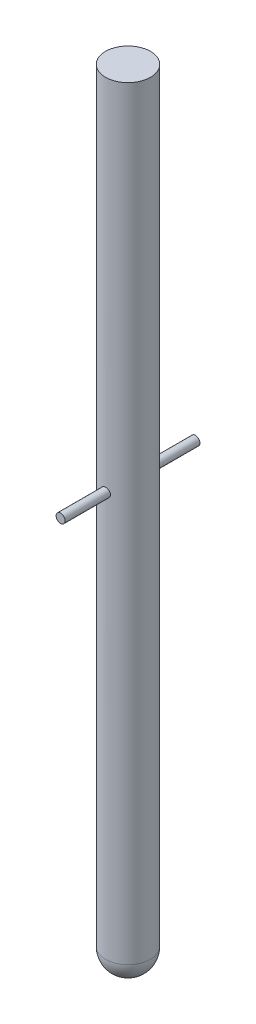
ISO-10303-21;
HEADER;
FILE_DESCRIPTION(('STEP AP214'),'2;1');
FILE_NAME('part.step','',(''),(''),'','','');
FILE_SCHEMA(('AUTOMOTIVE_DESIGN { 1 0 10303 214 1 1 1 1 }'));
ENDSEC;
DATA;
#1=APPLICATION_CONTEXT('core data for automotive mechanical design processes');
#2=APPLICATION_PROTOCOL_DEFINITION('international standard','automotive_design',2000,#1);
#3=PRODUCT_CONTEXT('',#1,'mechanical');
#4=PRODUCT('Part','Part','',(#3));
#5=PRODUCT_RELATED_PRODUCT_CATEGORY('part','',(#4));
#6=PRODUCT_DEFINITION_FORMATION('','',#4);
#7=PRODUCT_DEFINITION_CONTEXT('part definition',#1,'design');
#8=PRODUCT_DEFINITION('design','',#6,#7);
#9=PRODUCT_DEFINITION_SHAPE('','',#8);
#10=(LENGTH_UNIT() NAMED_UNIT(*) SI_UNIT(.MILLI.,.METRE.));
#11=(NAMED_UNIT(*) PLANE_ANGLE_UNIT() SI_UNIT($,.RADIAN.));
#12=(NAMED_UNIT(*) SI_UNIT($,.STERADIAN.) SOLID_ANGLE_UNIT());
#13=UNCERTAINTY_MEASURE_WITH_UNIT(LENGTH_MEASURE(1.E-05),#10,'distance_accuracy_value','');
#14=(GEOMETRIC_REPRESENTATION_CONTEXT(3) GLOBAL_UNCERTAINTY_ASSIGNED_CONTEXT((#13)) GLOBAL_UNIT_ASSIGNED_CONTEXT((#10,
#11,#12)) REPRESENTATION_CONTEXT('',''));
#15=CARTESIAN_POINT('',(0.,0.,0.));
#16=DIRECTION('',(0.,0.,1.));
#17=DIRECTION('',(1.,0.,0.));
#18=AXIS2_PLACEMENT_3D('',#15,#16,#17);
#19=CARTESIAN_POINT('',(0.,175.,0.));
#20=DIRECTION('',(0.,-1.,0.));
#21=DIRECTION('',(0.,0.,-1.));
#22=AXIS2_PLACEMENT_3D('',#19,#20,#21);
#23=CYLINDRICAL_SURFACE('',#22,5.);
#24=CARTESIAN_POINT('',(0.,5.,0.));
#25=DIRECTION('',(0.,-1.,0.));
#26=DIRECTION('',(0.,0.,-1.));
#27=AXIS2_PLACEMENT_3D('',#24,#25,#26);
#28=CIRCLE('',#27,5.);
#29=CARTESIAN_POINT('',(0.,5.,-5.));
#30=VERTEX_POINT('',#29);
#31=EDGE_CURVE('E10',#30,#30,#28,.F.);
#32=ORIENTED_EDGE('',*,*,#31,.T.);
#33=EDGE_LOOP('',(#32));
#34=FACE_BOUND('',#33,.T.);
#35=CARTESIAN_POINT('',(0.,96.,-5.));
#36=CARTESIAN_POINT('',(-0.0555769067926326,95.9999979555017,-4.99999897580871));
#37=CARTESIAN_POINT('',(-0.111179660201522,95.9953511570324,-4.99906385178231));
#38=CARTESIAN_POINT('',(-0.220813507689018,95.9769014998848,-4.99542365623231));
#39=CARTESIAN_POINT('',(-0.274843317541354,95.9630913671985,-4.99271717860186));
#40=CARTESIAN_POINT('',(-0.379730305263313,95.9267587263792,-4.98583649278287));
#41=CARTESIAN_POINT('',(-0.430590467933138,95.9042445631553,-4.98166369076718));
#42=CARTESIAN_POINT('',(-0.527807988864228,95.8511677524887,-4.97230398035314));
#43=CARTESIAN_POINT('',(-0.57416561507581,95.8206055843928,-4.96711713235707));
#44=CARTESIAN_POINT('',(-0.661693477314865,95.7518615057086,-4.9562216532997));
#45=CARTESIAN_POINT('',(-0.702793951158531,95.7135916446088,-4.95050745504347));
#46=CARTESIAN_POINT('',(-0.778036756608037,95.6307075836083,-4.93924180452588));
#47=CARTESIAN_POINT('',(-0.812178544770429,95.5860928886649,-4.93369036500424));
#48=CARTESIAN_POINT('',(-0.872831753347622,95.4912838069881,-4.92332441812615));
#49=CARTESIAN_POINT('',(-0.89927093886587,95.4410423562036,-4.91851707364946));
#50=CARTESIAN_POINT('',(-0.943305666580311,95.3367181809959,-4.91026268058418));
#51=CARTESIAN_POINT('',(-0.960902082437239,95.2826358366537,-4.90681549761962));
#52=CARTESIAN_POINT('',(-0.986525299884826,95.1729156360921,-4.90172805252205));
#53=CARTESIAN_POINT('',(-0.994674497958775,95.1173074558578,-4.90006470107188));
#54=CARTESIAN_POINT('',(-1.00155212772612,95.0054901786357,-4.89866375060627));
#55=CARTESIAN_POINT('',(-1.0002815227135,94.9492811436799,-4.89892595467841));
#56=CARTESIAN_POINT('',(-0.988454573101821,94.838753211979,-4.90132551148185));
#57=CARTESIAN_POINT('',(-0.978038540243909,94.7844185943727,-4.90343452858763));
#58=CARTESIAN_POINT('',(-0.948437884623055,94.678283923337,-4.90924546160001));
#59=CARTESIAN_POINT('',(-0.929252843100686,94.626483991081,-4.91294745357779));
#60=CARTESIAN_POINT('',(-0.882524783674724,94.5264847382964,-4.92155618500408));
#61=CARTESIAN_POINT('',(-0.854926151232117,94.4783121204308,-4.92647089813704));
#62=CARTESIAN_POINT('',(-0.79219357457268,94.3872291500272,-4.93694618773062));
#63=CARTESIAN_POINT('',(-0.75705876435683,94.3443194031488,-4.94250683838366));
#64=CARTESIAN_POINT('',(-0.67949993456058,94.2641705975431,-4.95377021241462));
#65=CARTESIAN_POINT('',(-0.636956161212438,94.2270474321409,-4.95947369210905));
#66=CARTESIAN_POINT('',(-0.546185024062002,94.1604461536988,-4.97028848714409));
#67=CARTESIAN_POINT('',(-0.497957587379384,94.1309681387064,-4.97539979488974));
#68=CARTESIAN_POINT('',(-0.397059386878918,94.080472490774,-4.98446690160887));
#69=CARTESIAN_POINT('',(-0.344381819585298,94.0594681063555,-4.98842088848272));
#70=CARTESIAN_POINT('',(-0.236148976448666,94.0266395259614,-4.99471408987858));
#71=CARTESIAN_POINT('',(-0.180594050072453,94.0148142179264,-4.99705350000531));
#72=CARTESIAN_POINT('',(-0.0691794056271565,94.0008435462057,-4.99982671866868));
#73=CARTESIAN_POINT('',(-0.0133403283255816,93.9985395804597,-5.0002917465247));
#74=CARTESIAN_POINT('',(0.0979249341927104,94.0032498589422,-4.99935051930103));
#75=CARTESIAN_POINT('',(0.15335114244379,94.0102635793526,-4.99794436941446));
#76=CARTESIAN_POINT('',(0.261705659946537,94.033278373544,-4.99343832008018));
#77=CARTESIAN_POINT('',(0.314651948339898,94.0491980684979,-4.99035376404207));
#78=CARTESIAN_POINT('',(0.417123627499664,94.0894839826558,-4.98283552061033));
#79=CARTESIAN_POINT('',(0.466648761637539,94.1138508346768,-4.97840173214227));
#80=CARTESIAN_POINT('',(0.561541173686218,94.1706824906513,-4.96859911533294));
#81=CARTESIAN_POINT('',(0.606850126752186,94.203242781039,-4.96321950437052));
#82=CARTESIAN_POINT('',(0.691418019119206,94.2754091912073,-4.95214734829882));
#83=CARTESIAN_POINT('',(0.730676308930766,94.3150160663999,-4.94645476968388));
#84=CARTESIAN_POINT('',(0.802640590774179,94.4008733518911,-4.93529303556965));
#85=CARTESIAN_POINT('',(0.835237702448654,94.4472157442213,-4.92982860233304));
#86=CARTESIAN_POINT('',(0.8921854200512,94.5448113613567,-4.91984191796194));
#87=CARTESIAN_POINT('',(0.916536355922897,94.5960643895735,-4.91531962913343));
#88=CARTESIAN_POINT('',(0.956151841581955,94.7017682461495,-4.90776740584383));
#89=CARTESIAN_POINT('',(0.971463499791046,94.7562008412103,-4.90472974872187));
#90=CARTESIAN_POINT('',(0.992708651627194,94.8669334534909,-4.90047436792025));
#91=CARTESIAN_POINT('',(0.998643368225111,94.9232332262093,-4.89925640691111));
#92=CARTESIAN_POINT('',(1.00092091086747,95.0350088645443,-4.89879149631379));
#93=CARTESIAN_POINT('',(0.997435788070897,95.090481148927,-4.89950919189301));
#94=CARTESIAN_POINT('',(0.981352304100062,95.200031649905,-4.90275573484614));
#95=CARTESIAN_POINT('',(0.968754016129299,95.2541098776948,-4.90528456767169));
#96=CARTESIAN_POINT('',(0.934878568498952,95.3592277112405,-4.91185264219159));
#97=CARTESIAN_POINT('',(0.913622506717341,95.4102743605024,-4.91588821018831));
#98=CARTESIAN_POINT('',(0.8630546446016,95.5081037207344,-4.9250171497417));
#99=CARTESIAN_POINT('',(0.833742168774879,95.5548860737252,-4.93011060998894));
#100=CARTESIAN_POINT('',(0.767305914786408,95.6437155721503,-4.94088960523225));
#101=CARTESIAN_POINT('',(0.730057887235172,95.6856687652676,-4.946583729097));
#102=CARTESIAN_POINT('',(0.649064369013133,95.7627862055292,-4.95786081871955));
#103=CARTESIAN_POINT('',(0.605317387153331,95.7979488903173,-4.96344375863185));
#104=CARTESIAN_POINT('',(0.512017629088246,95.8608346439465,-4.97393832387971));
#105=CARTESIAN_POINT('',(0.462408884429834,95.88847600328,-4.97884231219246));
#106=CARTESIAN_POINT('',(0.359166360940733,95.9349861225966,-4.98735125085));
#107=CARTESIAN_POINT('',(0.305536260863129,95.9538627895325,-4.99095737138616));
#108=CARTESIAN_POINT('',(0.209821488923785,95.9786519480447,-4.99576372595371));
#109=CARTESIAN_POINT('',(0.168281664013789,95.9866431937077,-4.99734303158452));
#110=CARTESIAN_POINT('',(0.0844995252100698,95.9973179123584,-4.99946154139893));
#111=CARTESIAN_POINT('',(0.0422572337486206,96.0000015545098,-5.00000077873155));
#112=CARTESIAN_POINT('',(0.,96.,-5.));
#113=B_SPLINE_CURVE_WITH_KNOTS('',3,(#35,#36,#37,#38,#39,#40,#41,#42,#43,#44,#45,#46,#47,#48,
#49,#50,#51,#52,#53,#54,#55,#56,#57,#58,#59,#60,#61,#62,#63,#64,#65,#66,#67,#68,#69,#70,#71,#72,
#73,#74,#75,#76,#77,#78,#79,#80,#81,#82,#83,#84,#85,#86,#87,#88,#89,#90,#91,#92,#93,#94,#95,#96,
#97,#98,#99,#100,#101,#102,#103,#104,#105,#106,#107,#108,#109,#110,#111,#112),.UNSPECIFIED.,.T.,
.F.,(4,2,2,2,2,2,2,2,2,2,2,2,2,2,2,2,2,2,2,2,2,2,2,2,2,2,2,2,2,2,2,2,2,2,2,2,2,2,4),(0.,
0.166576130661257,0.333284650691323,0.499833735250344,0.666372902230866,0.834932670112198,
1.00350559674737,1.17361195005923,1.34370149365198,1.51156185103586,1.67940504281224,
1.84471727006278,2.01003739253729,2.17647490203592,2.34293154749671,2.51238252491352,
2.68183567539821,2.85155274854024,3.02124925698035,3.18810735676265,3.35495607657867,
3.52030453950723,3.68566539216022,3.85305066033359,4.0204538834593,4.19040628579226,
4.36035188723465,4.5294038103272,4.69843368330414,4.86439722567702,5.03035943492609,
5.1959196125311,5.36149367581868,5.52988076239145,5.69830654532931,5.86849496675638,
6.03852955517518,6.16518775289894,6.29184191370997),.UNSPECIFIED.);
#114=CARTESIAN_POINT('',(0.,96.,-5.));
#115=VERTEX_POINT('',#114);
#116=EDGE_CURVE('E43',#115,#115,#113,.T.);
#117=ORIENTED_EDGE('',*,*,#116,.T.);
#118=EDGE_LOOP('',(#117));
#119=FACE_BOUND('',#118,.T.);
#120=CARTESIAN_POINT('',(1.,95.,4.89897948556636));
#121=CARTESIAN_POINT('',(0.999997945876045,94.944435624518,4.89898059043933));
#122=CARTESIAN_POINT('',(0.995353171723656,94.8888453766935,4.89993508346913));
#123=CARTESIAN_POINT('',(0.976912283588337,94.7792374948816,4.90364431385263));
#124=CARTESIAN_POINT('',(0.963108847071184,94.7252211553689,4.90640049166333));
#125=CARTESIAN_POINT('',(0.926795782617739,94.6203626966371,4.91338873700356));
#126=CARTESIAN_POINT('',(0.904294814152081,94.5695174784651,4.91761933615313));
#127=CARTESIAN_POINT('',(0.85124910767104,94.4723251553054,4.92707799486421));
#128=CARTESIAN_POINT('',(0.820704818601294,94.4259777994627,4.93230599875014));
#129=CARTESIAN_POINT('',(0.751979075653288,94.3384389961455,4.9432529969268));
#130=CARTESIAN_POINT('',(0.713705655913277,94.2973204121159,4.94897737836825));
#131=CARTESIAN_POINT('',(0.630806789021353,94.2220424664212,4.9602247230302));
#132=CARTESIAN_POINT('',(0.586180896978005,94.1878835925829,4.96574767210945));
#133=CARTESIAN_POINT('',(0.491361355924261,94.1272119823715,4.97602796417447));
#134=CARTESIAN_POINT('',(0.441122567672222,94.1007684861834,4.9807782144152));
#135=CARTESIAN_POINT('',(0.336804150387285,94.0567250629519,4.98891736883662));
#136=CARTESIAN_POINT('',(0.282724881420563,94.039124308099,4.99230640044127));
#137=CARTESIAN_POINT('',(0.173016773278501,94.0134928063804,4.9973032068841));
#138=CARTESIAN_POINT('',(0.117417739214821,94.005339022429,4.99893386288125));
#139=CARTESIAN_POINT('',(0.00561856843754478,93.9984490481617,5.00030921183606));
#140=CARTESIAN_POINT('',(-0.0505815098318344,93.9997119503542,5.0000540865276));
#141=CARTESIAN_POINT('',(-0.16114200074358,94.0115261802156,4.99770434868515));
#142=CARTESIAN_POINT('',(-0.215517214298462,94.0219449771678,4.99563598365838));
#143=CARTESIAN_POINT('',(-0.321731626580293,94.0515650324589,4.98992177159409));
#144=CARTESIAN_POINT('',(-0.373570723747121,94.0707666421919,4.98627586144039));
#145=CARTESIAN_POINT('',(-0.473619463200879,94.1175300401473,4.97777296019958));
#146=CARTESIAN_POINT('',(-0.521804174133894,94.1451437511049,4.97290848175224));
#147=CARTESIAN_POINT('',(-0.612905045859752,94.2079090772366,4.96250469473785));
#148=CARTESIAN_POINT('',(-0.655820599524997,94.2430615597705,4.95696530855222));
#149=CARTESIAN_POINT('',(-0.735951431053452,94.3206336221085,4.9457096436446));
#150=CARTESIAN_POINT('',(-0.773054316573625,94.3631691867296,4.93999196457516));
#151=CARTESIAN_POINT('',(-0.8396184931768,94.4539164424507,4.92911571598761));
#152=CARTESIAN_POINT('',(-0.869079639727745,94.5021282408832,4.92395715704548));
#153=CARTESIAN_POINT('',(-0.919562814801877,94.6030208318218,4.91478047472924));
#154=CARTESIAN_POINT('',(-0.940566647777705,94.6557109676396,4.91076481563549));
#155=CARTESIAN_POINT('',(-0.973390341627578,94.763971323724,4.90436476321273));
#156=CARTESIAN_POINT('',(-0.985211399456639,94.8195411676191,4.90198015728428));
#157=CARTESIAN_POINT('',(-0.999166006036049,94.930964857999,4.89915479267828));
#158=CARTESIAN_POINT('',(-1.00146185889791,94.9867975743103,4.89868147057154));
#159=CARTESIAN_POINT('',(-0.99673762831074,95.0980482231997,4.89964485688854));
#160=CARTESIAN_POINT('',(-0.989718073122444,95.1534661791189,4.90108145700388));
#161=CARTESIAN_POINT('',(-0.966702208074158,95.2617686402922,4.90567232494914));
#162=CARTESIAN_POINT('',(-0.950792620839299,95.3146723430358,4.90880999014497));
#163=CARTESIAN_POINT('',(-0.910541035308517,95.4170632790287,4.91643489351665));
#164=CARTESIAN_POINT('',(-0.886198342373177,95.4665502304357,4.9209222428627));
#165=CARTESIAN_POINT('',(-0.829404142215601,95.5614131099502,4.93081405962039));
#166=CARTESIAN_POINT('',(-0.796851077982758,95.6067270463008,4.93622971864903));
#167=CARTESIAN_POINT('',(-0.724695572212716,95.6913083120009,4.94733723826636));
#168=CARTESIAN_POINT('',(-0.68509240514454,95.7305750182493,4.95302912723818));
#169=CARTESIAN_POINT('',(-0.599232273497892,95.8025625591856,4.96415345869216));
#170=CARTESIAN_POINT('',(-0.552882498929632,95.83517365465,4.96958057708684));
#171=CARTESIAN_POINT('',(-0.455267896634757,95.8921458814996,4.9794712762862));
#172=CARTESIAN_POINT('',(-0.404003275433507,95.9165073593448,4.98393489755211));
#173=CARTESIAN_POINT('',(-0.298302680824014,95.9561288717466,4.99137294061067));
#174=CARTESIAN_POINT('',(-0.243886673478081,95.9714405182262,4.99435579142604));
#175=CARTESIAN_POINT('',(-0.133189454679918,95.9926912476639,4.9985323593766));
#176=CARTESIAN_POINT('',(-0.0769084687112198,95.9986314594757,4.99972629199843));
#177=CARTESIAN_POINT('',(0.0348728939036169,96.0009269809629,5.00018540454121));
#178=CARTESIAN_POINT('',(0.0903698121414952,95.9974472804562,4.99948378549351));
#179=CARTESIAN_POINT('',(0.199971031315635,95.9813660494522,4.99630043560318));
#180=CARTESIAN_POINT('',(0.254075349753685,95.9687646336519,4.99381872714351));
#181=CARTESIAN_POINT('',(0.359252749745087,95.9348710079084,4.98735498365001));
#182=CARTESIAN_POINT('',(0.410332443240268,95.9135986218688,4.98337637247912));
#183=CARTESIAN_POINT('',(0.508221220185941,95.8629877586691,4.97434722123382));
#184=CARTESIAN_POINT('',(0.555029965767404,95.8336486440963,4.96929659645878));
#185=CARTESIAN_POINT('',(0.643863890106355,95.7671806129379,4.95857599157868));
#186=CARTESIAN_POINT('',(0.6857997161165,95.7299336636132,4.95289733422142));
#187=CARTESIAN_POINT('',(0.762882617756842,95.6489497599042,4.94161222903622));
#188=CARTESIAN_POINT('',(0.79802808320271,95.6052112705313,4.93600579862875));
#189=CARTESIAN_POINT('',(0.860892219455198,95.5119206832998,4.92543342749964));
#190=CARTESIAN_POINT('',(0.888526814639765,95.4623110388396,4.92047503631328));
#191=CARTESIAN_POINT('',(0.935024049287808,95.3590672267003,4.91185237184445));
#192=CARTESIAN_POINT('',(0.95389464597929,95.3054367613021,4.90818692536957));
#193=CARTESIAN_POINT('',(0.978669139854274,95.2097375445634,4.90329681128922));
#194=CARTESIAN_POINT('',(0.986653898522987,95.1682145804886,4.90168784915661));
#195=CARTESIAN_POINT('',(0.997320017960409,95.0844660454464,4.8995287845803));
#196=CARTESIAN_POINT('',(1.00000156156205,95.0422404987518,4.89897864563277));
#197=CARTESIAN_POINT('',(1.,95.,4.89897948556636));
#198=B_SPLINE_CURVE_WITH_KNOTS('',3,(#120,#121,#122,#123,#124,#125,#126,#127,#128,#129,#130,
#131,#132,#133,#134,#135,#136,#137,#138,#139,#140,#141,#142,#143,#144,#145,#146,#147,#148,#149,
#150,#151,#152,#153,#154,#155,#156,#157,#158,#159,#160,#161,#162,#163,#164,#165,#166,#167,#168,
#169,#170,#171,#172,#173,#174,#175,#176,#177,#178,#179,#180,#181,#182,#183,#184,#185,#186,#187,
#188,#189,#190,#191,#192,#193,#194,#195,#196,#197),.UNSPECIFIED.,.T.,.F.,(4,2,2,2,2,2,2,2,2,2,2,
2,2,2,2,2,2,2,2,2,2,2,2,2,2,2,2,2,2,2,2,2,2,2,2,2,2,2,4),(0.,0.166538463856506,
0.333210239259257,0.499716497915567,0.666213464834841,0.834822525459335,1.00344340032917,
1.17353400434945,1.34360868244056,1.51144248880576,1.67926012113744,1.84468789631033,
2.01012229071247,2.17659924219799,2.34309535767562,2.51249346759979,2.68189478120216,
2.85165863170271,3.0214003501352,3.18823757802089,3.35506534525918,3.52029341780817,
3.68553510351895,3.85293059772018,4.02034332867706,4.19032601730948,4.36030156627602,
4.52929813576147,4.69827434689124,4.86431017412183,5.03034391364253,5.19600017072947,
5.3616695213218,5.53001152023094,5.69839338887278,5.86858898576537,6.03862975086429,
6.16523803634394,6.29184195681712),.UNSPECIFIED.);
#199=CARTESIAN_POINT('',(1.,95.,4.89897948556636));
#200=VERTEX_POINT('',#199);
#201=EDGE_CURVE('E48',#200,#200,#198,.T.);
#202=ORIENTED_EDGE('',*,*,#201,.T.);
#203=EDGE_LOOP('',(#202));
#204=FACE_BOUND('',#203,.T.);
#205=CARTESIAN_POINT('',(0.,175.,0.));
#206=DIRECTION('',(0.,1.,0.));
#207=DIRECTION('',(0.,0.,1.));
#208=AXIS2_PLACEMENT_3D('',#205,#206,#207);
#209=CIRCLE('',#208,5.);
#210=CARTESIAN_POINT('',(0.,175.,5.));
#211=VERTEX_POINT('',#210);
#212=EDGE_CURVE('E39',#211,#211,#209,.T.);
#213=ORIENTED_EDGE('',*,*,#212,.F.);
#214=EDGE_LOOP('',(#213));
#215=FACE_BOUND('',#214,.T.);
#216=ADVANCED_FACE('F32',(#34,#119,#204,#215),#23,.T.);
#217=CARTESIAN_POINT('',(0.,175.,0.));
#218=DIRECTION('',(0.,1.,0.));
#219=DIRECTION('',(0.,0.,1.));
#220=AXIS2_PLACEMENT_3D('',#217,#218,#219);
#221=PLANE('',#220);
#222=ORIENTED_EDGE('',*,*,#212,.T.);
#223=EDGE_LOOP('',(#222));
#224=FACE_BOUND('',#223,.T.);
#225=ADVANCED_FACE('F71',(#224),#221,.T.);
#226=CARTESIAN_POINT('',(0.,95.,15.));
#227=DIRECTION('',(0.,0.,1.));
#228=DIRECTION('',(1.,0.,0.));
#229=AXIS2_PLACEMENT_3D('',#226,#227,#228);
#230=PLANE('',#229);
#231=CARTESIAN_POINT('',(0.,95.,15.));
#232=DIRECTION('',(0.,0.,1.));
#233=DIRECTION('',(1.,0.,0.));
#234=AXIS2_PLACEMENT_3D('',#231,#232,#233);
#235=CIRCLE('',#234,1.);
#236=CARTESIAN_POINT('',(1.,95.,15.));
#237=VERTEX_POINT('',#236);
#238=EDGE_CURVE('E94',#237,#237,#235,.T.);
#239=ORIENTED_EDGE('',*,*,#238,.T.);
#240=EDGE_LOOP('',(#239));
#241=FACE_BOUND('',#240,.T.);
#242=ADVANCED_FACE('F74',(#241),#230,.T.);
#243=CARTESIAN_POINT('',(0.,95.,-15.));
#244=DIRECTION('',(0.,0.,1.));
#245=DIRECTION('',(1.,0.,0.));
#246=AXIS2_PLACEMENT_3D('',#243,#244,#245);
#247=CYLINDRICAL_SURFACE('',#246,1.);
#248=ORIENTED_EDGE('',*,*,#238,.F.);
#249=EDGE_LOOP('',(#248));
#250=FACE_BOUND('',#249,.T.);
#251=ORIENTED_EDGE('',*,*,#201,.F.);
#252=EDGE_LOOP('',(#251));
#253=FACE_BOUND('',#252,.T.);
#254=ADVANCED_FACE('F68',(#250,#253),#247,.T.);
#255=CARTESIAN_POINT('',(0.,95.,-15.));
#256=DIRECTION('',(0.,0.,1.));
#257=DIRECTION('',(1.,0.,0.));
#258=AXIS2_PLACEMENT_3D('',#255,#256,#257);
#259=CIRCLE('',#258,1.);
#260=CARTESIAN_POINT('',(1.,95.,-15.));
#261=VERTEX_POINT('',#260);
#262=EDGE_CURVE('E51',#261,#261,#259,.T.);
#263=ORIENTED_EDGE('',*,*,#262,.T.);
#264=EDGE_LOOP('',(#263));
#265=FACE_BOUND('',#264,.T.);
#266=ORIENTED_EDGE('',*,*,#116,.F.);
#267=EDGE_LOOP('',(#266));
#268=FACE_BOUND('',#267,.T.);
#269=ADVANCED_FACE('F63',(#265,#268),#247,.T.);
#270=CARTESIAN_POINT('',(0.,95.,-15.));
#271=DIRECTION('',(0.,0.,1.));
#272=DIRECTION('',(1.,0.,0.));
#273=AXIS2_PLACEMENT_3D('',#270,#271,#272);
#274=PLANE('',#273);
#275=ORIENTED_EDGE('',*,*,#262,.F.);
#276=EDGE_LOOP('',(#275));
#277=FACE_BOUND('',#276,.T.);
#278=ADVANCED_FACE('F67',(#277),#274,.F.);
#279=CARTESIAN_POINT('',(0.,5.,0.));
#280=DIRECTION('',(0.,1.,0.));
#281=DIRECTION('',(0.,0.,1.));
#282=AXIS2_PLACEMENT_3D('',#279,#280,#281);
#283=SPHERICAL_SURFACE('',#282,5.);
#284=ORIENTED_EDGE('',*,*,#31,.F.);
#285=EDGE_LOOP('',(#284));
#286=FACE_BOUND('',#285,.T.);
#287=ADVANCED_FACE('F34',(#286),#283,.T.);
#288=CLOSED_SHELL('',(#216,#225,#242,#254,#269,#278,#287));
#289=MANIFOLD_SOLID_BREP('B2',#288);
#290=ADVANCED_BREP_SHAPE_REPRESENTATION('',(#18,#289),#14);
#291=SHAPE_DEFINITION_REPRESENTATION(#9,#290);
ENDSEC;
END-ISO-10303-21;
